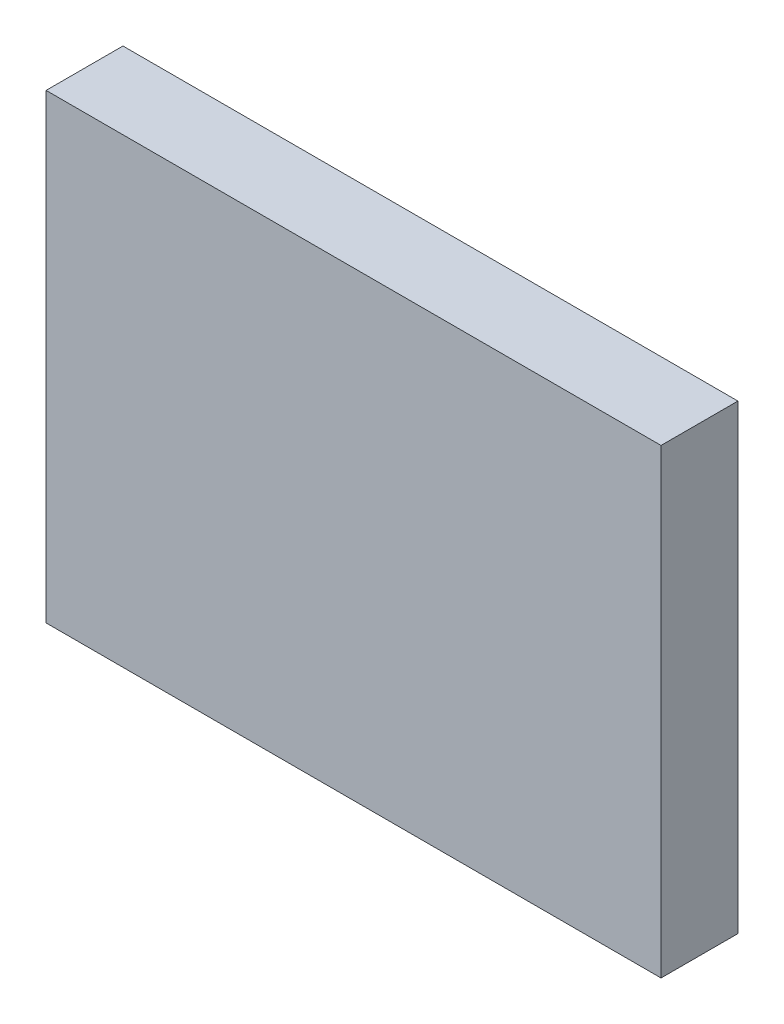
ISO-10303-21;
HEADER;
FILE_DESCRIPTION(('STEP AP214'),'2;1');
FILE_NAME('part.step','',(''),(''),'','','');
FILE_SCHEMA(('AUTOMOTIVE_DESIGN { 1 0 10303 214 1 1 1 1 }'));
ENDSEC;
DATA;
#1=APPLICATION_CONTEXT('core data for automotive mechanical design processes');
#2=APPLICATION_PROTOCOL_DEFINITION('international standard','automotive_design',2000,#1);
#3=PRODUCT_CONTEXT('',#1,'mechanical');
#4=PRODUCT('Part','Part','',(#3));
#5=PRODUCT_RELATED_PRODUCT_CATEGORY('part','',(#4));
#6=PRODUCT_DEFINITION_FORMATION('','',#4);
#7=PRODUCT_DEFINITION_CONTEXT('part definition',#1,'design');
#8=PRODUCT_DEFINITION('design','',#6,#7);
#9=PRODUCT_DEFINITION_SHAPE('','',#8);
#10=(LENGTH_UNIT() NAMED_UNIT(*) SI_UNIT(.MILLI.,.METRE.));
#11=(NAMED_UNIT(*) PLANE_ANGLE_UNIT() SI_UNIT($,.RADIAN.));
#12=(NAMED_UNIT(*) SI_UNIT($,.STERADIAN.) SOLID_ANGLE_UNIT());
#13=UNCERTAINTY_MEASURE_WITH_UNIT(LENGTH_MEASURE(1.E-05),#10,'distance_accuracy_value','');
#14=(GEOMETRIC_REPRESENTATION_CONTEXT(3) GLOBAL_UNCERTAINTY_ASSIGNED_CONTEXT((#13)) GLOBAL_UNIT_ASSIGNED_CONTEXT((#10,
#11,#12)) REPRESENTATION_CONTEXT('',''));
#15=CARTESIAN_POINT('',(0.,0.,0.));
#16=DIRECTION('',(0.,0.,1.));
#17=DIRECTION('',(1.,0.,0.));
#18=AXIS2_PLACEMENT_3D('',#15,#16,#17);
#19=CARTESIAN_POINT('',(0.,0.,12.7));
#20=DIRECTION('',(1.,0.,0.));
#21=DIRECTION('',(0.,0.,-1.));
#22=AXIS2_PLACEMENT_3D('',#19,#20,#21);
#23=PLANE('',#22);
#24=DIRECTION('',(0.,-1.,0.));
#25=VECTOR('',#24,1.);
#26=CARTESIAN_POINT('',(0.,0.,0.));
#27=LINE('',#26,#25);
#28=CARTESIAN_POINT('',(0.,76.2,0.));
#29=VERTEX_POINT('',#28);
#30=CARTESIAN_POINT('',(0.,0.,0.));
#31=VERTEX_POINT('',#30);
#32=EDGE_CURVE('E112',#29,#31,#27,.T.);
#33=ORIENTED_EDGE('',*,*,#32,.T.);
#34=DIRECTION('',(0.,0.,-1.));
#35=VECTOR('',#34,1.);
#36=CARTESIAN_POINT('',(0.,0.,12.7));
#37=LINE('',#36,#35);
#38=CARTESIAN_POINT('',(0.,0.,12.7));
#39=VERTEX_POINT('',#38);
#40=EDGE_CURVE('E11',#39,#31,#37,.T.);
#41=ORIENTED_EDGE('',*,*,#40,.F.);
#42=DIRECTION('',(0.,-1.,0.));
#43=VECTOR('',#42,1.);
#44=CARTESIAN_POINT('',(0.,0.,12.7));
#45=LINE('',#44,#43);
#46=CARTESIAN_POINT('',(0.,76.2,12.7));
#47=VERTEX_POINT('',#46);
#48=EDGE_CURVE('E98',#47,#39,#45,.T.);
#49=ORIENTED_EDGE('',*,*,#48,.F.);
#50=DIRECTION('',(0.,0.,-1.));
#51=VECTOR('',#50,1.);
#52=CARTESIAN_POINT('',(0.,76.2,12.7));
#53=LINE('',#52,#51);
#54=EDGE_CURVE('E107',#47,#29,#53,.T.);
#55=ORIENTED_EDGE('',*,*,#54,.T.);
#56=EDGE_LOOP('',(#33,#41,#49,#55));
#57=FACE_BOUND('',#56,.T.);
#58=ADVANCED_FACE('F50',(#57),#23,.F.);
#59=CARTESIAN_POINT('',(0.,0.,12.7));
#60=DIRECTION('',(0.,1.,0.));
#61=DIRECTION('',(0.,0.,1.));
#62=AXIS2_PLACEMENT_3D('',#59,#60,#61);
#63=PLANE('',#62);
#64=DIRECTION('',(1.,0.,0.));
#65=VECTOR('',#64,1.);
#66=CARTESIAN_POINT('',(0.,0.,0.));
#67=LINE('',#66,#65);
#68=CARTESIAN_POINT('',(101.6,0.,0.));
#69=VERTEX_POINT('',#68);
#70=EDGE_CURVE('E104',#31,#69,#67,.T.);
#71=ORIENTED_EDGE('',*,*,#70,.T.);
#72=DIRECTION('',(0.,0.,-1.));
#73=VECTOR('',#72,1.);
#74=CARTESIAN_POINT('',(101.6,0.,12.7));
#75=LINE('',#74,#73);
#76=CARTESIAN_POINT('',(101.6,0.,12.7));
#77=VERTEX_POINT('',#76);
#78=EDGE_CURVE('E57',#77,#69,#75,.T.);
#79=ORIENTED_EDGE('',*,*,#78,.F.);
#80=DIRECTION('',(1.,0.,0.));
#81=VECTOR('',#80,1.);
#82=CARTESIAN_POINT('',(0.,0.,12.7));
#83=LINE('',#82,#81);
#84=EDGE_CURVE('E92',#39,#77,#83,.T.);
#85=ORIENTED_EDGE('',*,*,#84,.F.);
#86=ORIENTED_EDGE('',*,*,#40,.T.);
#87=EDGE_LOOP('',(#71,#79,#85,#86));
#88=FACE_BOUND('',#87,.T.);
#89=ADVANCED_FACE('F105',(#88),#63,.F.);
#90=CARTESIAN_POINT('',(101.6,0.,12.7));
#91=DIRECTION('',(-1.,0.,0.));
#92=DIRECTION('',(0.,0.,1.));
#93=AXIS2_PLACEMENT_3D('',#90,#91,#92);
#94=PLANE('',#93);
#95=DIRECTION('',(0.,1.,0.));
#96=VECTOR('',#95,1.);
#97=CARTESIAN_POINT('',(101.6,0.,0.));
#98=LINE('',#97,#96);
#99=CARTESIAN_POINT('',(101.6,76.2,0.));
#100=VERTEX_POINT('',#99);
#101=EDGE_CURVE('E83',#69,#100,#98,.T.);
#102=ORIENTED_EDGE('',*,*,#101,.T.);
#103=DIRECTION('',(0.,0.,-1.));
#104=VECTOR('',#103,1.);
#105=CARTESIAN_POINT('',(101.6,76.2,12.7));
#106=LINE('',#105,#104);
#107=CARTESIAN_POINT('',(101.6,76.2,12.7));
#108=VERTEX_POINT('',#107);
#109=EDGE_CURVE('E101',#108,#100,#106,.T.);
#110=ORIENTED_EDGE('',*,*,#109,.F.);
#111=DIRECTION('',(0.,1.,0.));
#112=VECTOR('',#111,1.);
#113=CARTESIAN_POINT('',(101.6,0.,12.7));
#114=LINE('',#113,#112);
#115=EDGE_CURVE('E100',#77,#108,#114,.T.);
#116=ORIENTED_EDGE('',*,*,#115,.F.);
#117=ORIENTED_EDGE('',*,*,#78,.T.);
#118=EDGE_LOOP('',(#102,#110,#116,#117));
#119=FACE_BOUND('',#118,.T.);
#120=ADVANCED_FACE('F103',(#119),#94,.F.);
#121=CARTESIAN_POINT('',(0.,76.2,12.7));
#122=DIRECTION('',(0.,-1.,0.));
#123=DIRECTION('',(0.,0.,-1.));
#124=AXIS2_PLACEMENT_3D('',#121,#122,#123);
#125=PLANE('',#124);
#126=DIRECTION('',(-1.,0.,0.));
#127=VECTOR('',#126,1.);
#128=CARTESIAN_POINT('',(0.,76.2,0.));
#129=LINE('',#128,#127);
#130=EDGE_CURVE('E90',#100,#29,#129,.T.);
#131=ORIENTED_EDGE('',*,*,#130,.T.);
#132=ORIENTED_EDGE('',*,*,#54,.F.);
#133=DIRECTION('',(-1.,0.,0.));
#134=VECTOR('',#133,1.);
#135=CARTESIAN_POINT('',(0.,76.2,12.7));
#136=LINE('',#135,#134);
#137=EDGE_CURVE('E63',#108,#47,#136,.T.);
#138=ORIENTED_EDGE('',*,*,#137,.F.);
#139=ORIENTED_EDGE('',*,*,#109,.T.);
#140=EDGE_LOOP('',(#131,#132,#138,#139));
#141=FACE_BOUND('',#140,.T.);
#142=ADVANCED_FACE('F119',(#141),#125,.F.);
#143=CARTESIAN_POINT('',(0.,0.,12.7));
#144=DIRECTION('',(0.,0.,-1.));
#145=DIRECTION('',(-1.,0.,0.));
#146=AXIS2_PLACEMENT_3D('',#143,#144,#145);
#147=PLANE('',#146);
#148=ORIENTED_EDGE('',*,*,#48,.T.);
#149=ORIENTED_EDGE('',*,*,#84,.T.);
#150=ORIENTED_EDGE('',*,*,#115,.T.);
#151=ORIENTED_EDGE('',*,*,#137,.T.);
#152=EDGE_LOOP('',(#148,#149,#150,#151));
#153=FACE_BOUND('',#152,.T.);
#154=ADVANCED_FACE('F94',(#153),#147,.F.);
#155=CARTESIAN_POINT('',(0.,0.,0.));
#156=DIRECTION('',(0.,0.,-1.));
#157=DIRECTION('',(-1.,0.,0.));
#158=AXIS2_PLACEMENT_3D('',#155,#156,#157);
#159=PLANE('',#158);
#160=ORIENTED_EDGE('',*,*,#32,.F.);
#161=ORIENTED_EDGE('',*,*,#130,.F.);
#162=ORIENTED_EDGE('',*,*,#101,.F.);
#163=ORIENTED_EDGE('',*,*,#70,.F.);
#164=EDGE_LOOP('',(#160,#161,#162,#163));
#165=FACE_BOUND('',#164,.T.);
#166=ADVANCED_FACE('F123',(#165),#159,.T.);
#167=CLOSED_SHELL('',(#58,#89,#120,#142,#154,#166));
#168=MANIFOLD_SOLID_BREP('B2',#167);
#169=ADVANCED_BREP_SHAPE_REPRESENTATION('',(#18,#168),#14);
#170=SHAPE_DEFINITION_REPRESENTATION(#9,#169);
ENDSEC;
END-ISO-10303-21;
